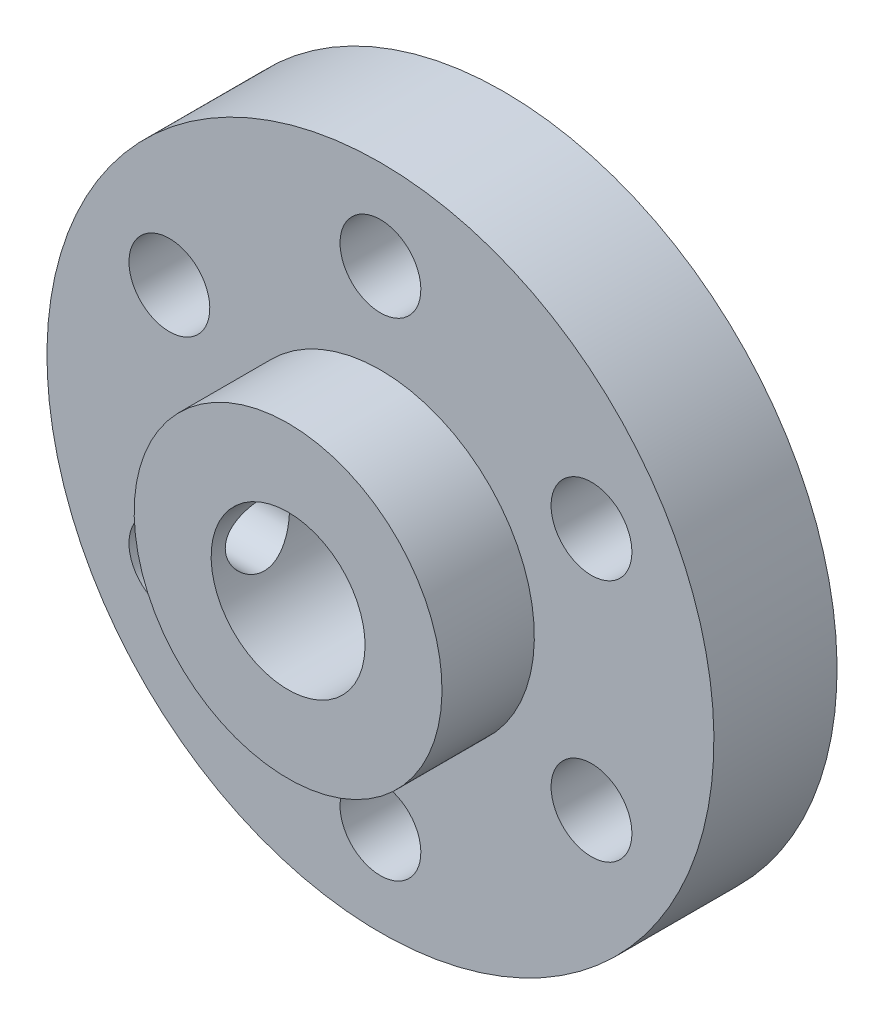
ISO-10303-21;
HEADER;
FILE_DESCRIPTION(('STEP AP214'),'2;1');
FILE_NAME('part.step','',(''),(''),'','','');
FILE_SCHEMA(('AUTOMOTIVE_DESIGN { 1 0 10303 214 1 1 1 1 }'));
ENDSEC;
DATA;
#1=APPLICATION_CONTEXT('core data for automotive mechanical design processes');
#2=APPLICATION_PROTOCOL_DEFINITION('international standard','automotive_design',2000,#1);
#3=PRODUCT_CONTEXT('',#1,'mechanical');
#4=PRODUCT('Part','Part','',(#3));
#5=PRODUCT_RELATED_PRODUCT_CATEGORY('part','',(#4));
#6=PRODUCT_DEFINITION_FORMATION('','',#4);
#7=PRODUCT_DEFINITION_CONTEXT('part definition',#1,'design');
#8=PRODUCT_DEFINITION('design','',#6,#7);
#9=PRODUCT_DEFINITION_SHAPE('','',#8);
#10=(LENGTH_UNIT() NAMED_UNIT(*) SI_UNIT(.MILLI.,.METRE.));
#11=(NAMED_UNIT(*) PLANE_ANGLE_UNIT() SI_UNIT($,.RADIAN.));
#12=(NAMED_UNIT(*) SI_UNIT($,.STERADIAN.) SOLID_ANGLE_UNIT());
#13=UNCERTAINTY_MEASURE_WITH_UNIT(LENGTH_MEASURE(1.E-05),#10,'distance_accuracy_value','');
#14=(GEOMETRIC_REPRESENTATION_CONTEXT(3) GLOBAL_UNCERTAINTY_ASSIGNED_CONTEXT((#13)) GLOBAL_UNIT_ASSIGNED_CONTEXT((#10,
#11,#12)) REPRESENTATION_CONTEXT('',''));
#15=CARTESIAN_POINT('',(0.,0.,0.));
#16=DIRECTION('',(0.,0.,1.));
#17=DIRECTION('',(1.,0.,0.));
#18=AXIS2_PLACEMENT_3D('',#15,#16,#17);
#19=CARTESIAN_POINT('',(0.,13.,0.));
#20=DIRECTION('',(0.,0.,-1.));
#21=DIRECTION('',(0.,1.,0.));
#22=AXIS2_PLACEMENT_3D('',#19,#20,#21);
#23=PLANE('',#22);
#24=CARTESIAN_POINT('',(0.,-9.5,0.));
#25=DIRECTION('',(0.,0.,-1.));
#26=DIRECTION('',(0.,1.,0.));
#27=AXIS2_PLACEMENT_3D('',#24,#25,#26);
#28=CIRCLE('',#27,1.575);
#29=CARTESIAN_POINT('',(0.,-7.925,0.));
#30=VERTEX_POINT('',#29);
#31=EDGE_CURVE('E86',#30,#30,#28,.T.);
#32=ORIENTED_EDGE('',*,*,#31,.F.);
#33=EDGE_LOOP('',(#32));
#34=FACE_BOUND('',#33,.T.);
#35=CARTESIAN_POINT('',(8.22724133595213,-4.75000000000006,0.));
#36=DIRECTION('',(0.,0.,-1.));
#37=DIRECTION('',(0.,1.,0.));
#38=AXIS2_PLACEMENT_3D('',#35,#36,#37);
#39=CIRCLE('',#38,1.575);
#40=CARTESIAN_POINT('',(8.22724133595213,-3.17500000000007,0.));
#41=VERTEX_POINT('',#40);
#42=EDGE_CURVE('E80',#41,#41,#39,.T.);
#43=ORIENTED_EDGE('',*,*,#42,.F.);
#44=EDGE_LOOP('',(#43));
#45=FACE_BOUND('',#44,.T.);
#46=CARTESIAN_POINT('',(8.2272413359522,4.74999999999996,0.));
#47=DIRECTION('',(0.,0.,-1.));
#48=DIRECTION('',(0.,1.,0.));
#49=AXIS2_PLACEMENT_3D('',#46,#47,#48);
#50=CIRCLE('',#49,1.575);
#51=CARTESIAN_POINT('',(8.2272413359522,6.32499999999995,0.));
#52=VERTEX_POINT('',#51);
#53=EDGE_CURVE('E74',#52,#52,#50,.T.);
#54=ORIENTED_EDGE('',*,*,#53,.F.);
#55=EDGE_LOOP('',(#54));
#56=FACE_BOUND('',#55,.T.);
#57=CARTESIAN_POINT('',(0.,9.5,0.));
#58=DIRECTION('',(0.,0.,-1.));
#59=DIRECTION('',(0.,1.,0.));
#60=AXIS2_PLACEMENT_3D('',#57,#58,#59);
#61=CIRCLE('',#60,1.575);
#62=CARTESIAN_POINT('',(0.,11.075,0.));
#63=VERTEX_POINT('',#62);
#64=EDGE_CURVE('E68',#63,#63,#61,.T.);
#65=ORIENTED_EDGE('',*,*,#64,.F.);
#66=EDGE_LOOP('',(#65));
#67=FACE_BOUND('',#66,.T.);
#68=CARTESIAN_POINT('',(-8.22724133595216,4.75000000000001,0.));
#69=DIRECTION('',(0.,0.,-1.));
#70=DIRECTION('',(0.,1.,0.));
#71=AXIS2_PLACEMENT_3D('',#68,#69,#70);
#72=CIRCLE('',#71,1.575);
#73=CARTESIAN_POINT('',(-8.22724133595216,6.325,0.));
#74=VERTEX_POINT('',#73);
#75=EDGE_CURVE('E62',#74,#74,#72,.T.);
#76=ORIENTED_EDGE('',*,*,#75,.F.);
#77=EDGE_LOOP('',(#76));
#78=FACE_BOUND('',#77,.T.);
#79=CARTESIAN_POINT('',(-8.22724133595216,-4.75000000000001,0.));
#80=DIRECTION('',(0.,0.,-1.));
#81=DIRECTION('',(0.,1.,0.));
#82=AXIS2_PLACEMENT_3D('',#79,#80,#81);
#83=CIRCLE('',#82,1.575);
#84=CARTESIAN_POINT('',(-8.22724133595216,-3.17500000000001,0.));
#85=VERTEX_POINT('',#84);
#86=EDGE_CURVE('E56',#85,#85,#83,.T.);
#87=ORIENTED_EDGE('',*,*,#86,.F.);
#88=EDGE_LOOP('',(#87));
#89=FACE_BOUND('',#88,.T.);
#90=CARTESIAN_POINT('',(0.,0.,0.));
#91=DIRECTION('',(0.,0.,-1.));
#92=DIRECTION('',(0.,1.,0.));
#93=AXIS2_PLACEMENT_3D('',#90,#91,#92);
#94=CIRCLE('',#93,13.);
#95=CARTESIAN_POINT('',(0.,13.,0.));
#96=VERTEX_POINT('',#95);
#97=EDGE_CURVE('E53',#96,#96,#94,.T.);
#98=ORIENTED_EDGE('',*,*,#97,.T.);
#99=EDGE_LOOP('',(#98));
#100=FACE_BOUND('',#99,.T.);
#101=CARTESIAN_POINT('',(0.,0.,0.));
#102=DIRECTION('',(0.,0.,-1.));
#103=DIRECTION('',(0.,1.,0.));
#104=AXIS2_PLACEMENT_3D('',#101,#102,#103);
#105=CIRCLE('',#104,3.);
#106=CARTESIAN_POINT('',(0.,3.,0.));
#107=VERTEX_POINT('',#106);
#108=EDGE_CURVE('E10',#107,#107,#105,.T.);
#109=ORIENTED_EDGE('',*,*,#108,.F.);
#110=EDGE_LOOP('',(#109));
#111=FACE_BOUND('',#110,.T.);
#112=ADVANCED_FACE('F31',(#34,#45,#56,#67,#78,#89,#100,#111),#23,.T.);
#113=CARTESIAN_POINT('',(0.,0.,6.17319530981986));
#114=DIRECTION('',(0.,0.,-1.));
#115=DIRECTION('',(0.,1.,0.));
#116=AXIS2_PLACEMENT_3D('',#113,#114,#115);
#117=CYLINDRICAL_SURFACE('',#116,3.);
#118=CARTESIAN_POINT('',(-3.,0.,5.35));
#119=CARTESIAN_POINT('',(-2.99999458367273,-0.0669580526362668,5.3500072050913));
#120=CARTESIAN_POINT('',(-2.9977323297471,-0.134021397063841,5.35541195852813));
#121=CARTESIAN_POINT('',(-2.98890153579552,-0.266247371156347,5.37683906492018));
#122=CARTESIAN_POINT('',(-2.98232175901028,-0.331404576423565,5.39288912446425));
#123=CARTESIAN_POINT('',(-2.96556289038127,-0.457688733653088,5.43491109178059));
#124=CARTESIAN_POINT('',(-2.95539599975004,-0.518828524426269,5.46084938946815));
#125=CARTESIAN_POINT('',(-2.93245286470664,-0.635829756679802,5.52177282323257));
#126=CARTESIAN_POINT('',(-2.91967741092849,-0.69169279001594,5.55675521897087));
#127=CARTESIAN_POINT('',(-2.89207828351869,-0.799448403559512,5.63662898259088));
#128=CARTESIAN_POINT('',(-2.87718753326093,-0.851041267517769,5.68190130878975));
#129=CARTESIAN_POINT('',(-2.84732714068514,-0.946159821091263,5.78026433478257));
#130=CARTESIAN_POINT('',(-2.83235746106809,-0.989681263153086,5.83335912489451));
#131=CARTESIAN_POINT('',(-2.80321021812995,-1.06953737697066,5.94902677756489));
#132=CARTESIAN_POINT('',(-2.78910786873385,-1.10541308153925,6.01193744842654));
#133=CARTESIAN_POINT('',(-2.76435572357005,-1.16593940588866,6.14357325792093));
#134=CARTESIAN_POINT('',(-2.75370415000823,-1.19059580836291,6.21229537948445));
#135=CARTESIAN_POINT('',(-2.73778555387705,-1.22674598312159,6.35015369176792));
#136=CARTESIAN_POINT('',(-2.73228387651787,-1.23881657877606,6.41911048339215));
#137=CARTESIAN_POINT('',(-2.72661326219504,-1.25125209967796,6.55827329268657));
#138=CARTESIAN_POINT('',(-2.7264413842526,-1.25162348054397,6.62847860002574));
#139=CARTESIAN_POINT('',(-2.73125119560853,-1.24108450363674,6.76240006043494));
#140=CARTESIAN_POINT('',(-2.73583882723623,-1.23103681112301,6.82620109656446));
#141=CARTESIAN_POINT('',(-2.74898482773796,-1.20139191015777,6.95111209100039));
#142=CARTESIAN_POINT('',(-2.75754395703564,-1.18179287287177,7.01222153149177));
#143=CARTESIAN_POINT('',(-2.77786184772756,-1.13321958727571,7.13155770299144));
#144=CARTESIAN_POINT('',(-2.78968481949136,-1.10405471539236,7.18969542091338));
#145=CARTESIAN_POINT('',(-2.81518331141086,-1.03731242580562,7.30047773388015));
#146=CARTESIAN_POINT('',(-2.82885956129779,-0.999731690519545,7.35312015061352));
#147=CARTESIAN_POINT('',(-2.85792976877979,-0.913495965543836,7.45609995873284));
#148=CARTESIAN_POINT('',(-2.87337121404473,-0.864173483207528,7.50586656738544));
#149=CARTESIAN_POINT('',(-2.90325673112529,-0.757729591051513,7.59661350295918));
#150=CARTESIAN_POINT('',(-2.9177005687701,-0.700606359448458,7.63759177169218));
#151=CARTESIAN_POINT('',(-2.94438283556473,-0.578447948693378,7.71043582361627));
#152=CARTESIAN_POINT('',(-2.95656266543334,-0.513260582447682,7.74206944515068));
#153=CARTESIAN_POINT('',(-2.97689481414803,-0.377852402526833,7.79372113960326));
#154=CARTESIAN_POINT('',(-2.985049358458,-0.307634394795037,7.81374563194382));
#155=CARTESIAN_POINT('',(-2.99599641186385,-0.168928113346229,7.84041599212664));
#156=CARTESIAN_POINT('',(-2.99909541047125,-0.10061128527864,7.84782785744375));
#157=CARTESIAN_POINT('',(-3.00056050368745,0.0363546554960884,7.85134622361409));
#158=CARTESIAN_POINT('',(-2.99892795711939,0.105003667152635,7.847455970252));
#159=CARTESIAN_POINT('',(-2.9913121765694,0.237098242341435,7.82902891519393));
#160=CARTESIAN_POINT('',(-2.9855488728399,0.300632966639386,7.8150300459028));
#161=CARTESIAN_POINT('',(-2.97048606772414,0.42438274897109,7.77753180545922));
#162=CARTESIAN_POINT('',(-2.96118611959704,0.484597386518361,7.7540312340497));
#163=CARTESIAN_POINT('',(-2.93958270645166,0.602108999869135,7.69742902428788));
#164=CARTESIAN_POINT('',(-2.92719491469281,0.659257236855322,7.66405181685397));
#165=CARTESIAN_POINT('',(-2.9007380457909,0.767346216231428,7.58894662220831));
#166=CARTESIAN_POINT('',(-2.88666826768733,0.818284352601941,7.54721514847073));
#167=CARTESIAN_POINT('',(-2.85712087895437,0.916333430274264,7.45309676672759));
#168=CARTESIAN_POINT('',(-2.84161451591029,0.962910697979835,7.40016149701374));
#169=CARTESIAN_POINT('',(-2.81184336768005,1.04666984610551,7.28697872406461));
#170=CARTESIAN_POINT('',(-2.79757886493438,1.08384959285617,7.22672956482827));
#171=CARTESIAN_POINT('',(-2.77181386243988,1.14815960208699,7.09938582469742));
#172=CARTESIAN_POINT('',(-2.76035562555111,1.17513918237329,7.03220596448517));
#173=CARTESIAN_POINT('',(-2.74208355658957,1.21717413951573,6.89362940618989));
#174=CARTESIAN_POINT('',(-2.73526589555752,1.23223934863688,6.82223623751665));
#175=CARTESIAN_POINT('',(-2.72763164537264,1.24904080348901,6.68318130080079));
#176=CARTESIAN_POINT('',(-2.72639350967162,1.25171380413129,6.61565533770739));
#177=CARTESIAN_POINT('',(-2.72893853011024,1.24615575523912,6.4811571388589));
#178=CARTESIAN_POINT('',(-2.73272091540306,1.23792637964722,6.41418481968631));
#179=CARTESIAN_POINT('',(-2.74449551302268,1.21158404780491,6.28590725253111));
#180=CARTESIAN_POINT('',(-2.7522835484648,1.19394903571466,6.22448332653661));
#181=CARTESIAN_POINT('',(-2.77103181199189,1.14976328202135,6.10545197864277));
#182=CARTESIAN_POINT('',(-2.78199293131693,1.12321003517252,6.04784563460122));
#183=CARTESIAN_POINT('',(-2.80666954560013,1.0601028593549,5.93430410405088));
#184=CARTESIAN_POINT('',(-2.82051102713679,1.02304360910483,5.87867766983171));
#185=CARTESIAN_POINT('',(-2.84903689053839,0.940684072630393,5.77413986063932));
#186=CARTESIAN_POINT('',(-2.86372156345875,0.89538092890562,5.72523082439943));
#187=CARTESIAN_POINT('',(-2.89356392850106,0.793902045778822,5.63185131831526));
#188=CARTESIAN_POINT('',(-2.90867817511791,0.737174739949029,5.58796356715935));
#189=CARTESIAN_POINT('',(-2.9366014362202,0.6166000792532,5.51030054645637));
#190=CARTESIAN_POINT('',(-2.9494093991674,0.552749497945747,5.47652988511044));
#191=CARTESIAN_POINT('',(-2.97109183362461,0.420732056717951,5.42079015456011));
#192=CARTESIAN_POINT('',(-2.98002782581964,0.352653990980636,5.3986352333827));
#193=CARTESIAN_POINT('',(-2.99321009768625,0.213410421846559,5.36629367092216));
#194=CARTESIAN_POINT('',(-2.99747105811967,0.142255316980958,5.35606955747012));
#195=CARTESIAN_POINT('',(-2.99972287568934,0.0472360819191838,5.35066683891355));
#196=CARTESIAN_POINT('',(-3.00000191102536,0.0236245946756573,5.34999745785078));
#197=CARTESIAN_POINT('',(-3.,0.,5.35));
#198=B_SPLINE_CURVE_WITH_KNOTS('',3,(#118,#119,#120,#121,#122,#123,#124,#125,#126,#127,#128,
#129,#130,#131,#132,#133,#134,#135,#136,#137,#138,#139,#140,#141,#142,#143,#144,#145,#146,#147,
#148,#149,#150,#151,#152,#153,#154,#155,#156,#157,#158,#159,#160,#161,#162,#163,#164,#165,#166,
#167,#168,#169,#170,#171,#172,#173,#174,#175,#176,#177,#178,#179,#180,#181,#182,#183,#184,#185,
#186,#187,#188,#189,#190,#191,#192,#193,#194,#195,#196,#197),.UNSPECIFIED.,.T.,.F.,(4,2,2,2,2,2,
2,2,2,2,2,2,2,2,2,2,2,2,2,2,2,2,2,2,2,2,2,2,2,2,2,2,2,2,2,2,2,2,2,4),(0.,0.200806918883939,
0.402138540628697,0.602791851906301,0.803384436852975,1.01317936288807,1.22308438131466,
1.44331724539125,1.66343646730588,1.87295273137558,2.08235338249046,2.27570157202557,
2.46908679727213,2.66658713058715,2.86416545717207,3.07844141127897,3.29276749314588,
3.51204055060813,3.73119224218297,3.93648443393251,4.14171767493172,4.33676589735722,
4.53183876601785,4.73297135272161,4.93418805469496,5.14978488029295,5.36543061240342,
5.58414788359524,5.80268447074581,6.00439877559644,6.20608211297537,6.39837649964763,
6.59072494950613,6.79463893397442,6.99862373425944,7.2174653500489,7.43640649428583,
7.65172855819386,7.86637250469322,7.93722256499099),.UNSPECIFIED.);
#199=CARTESIAN_POINT('',(-3.,0.,5.35));
#200=VERTEX_POINT('',#199);
#201=EDGE_CURVE('E122',#200,#200,#198,.T.);
#202=ORIENTED_EDGE('',*,*,#201,.T.);
#203=EDGE_LOOP('',(#202));
#204=FACE_BOUND('',#203,.T.);
#205=CARTESIAN_POINT('',(-3.,0.,1.15));
#206=CARTESIAN_POINT('',(-2.99999458367273,-0.0669580526362669,1.1500072050913));
#207=CARTESIAN_POINT('',(-2.9977323297471,-0.134021397063841,1.15541195852813));
#208=CARTESIAN_POINT('',(-2.98890153579552,-0.266247371156347,1.17683906492018));
#209=CARTESIAN_POINT('',(-2.98232175901028,-0.331404576423565,1.19288912446425));
#210=CARTESIAN_POINT('',(-2.96556289038127,-0.457688733653088,1.23491109178059));
#211=CARTESIAN_POINT('',(-2.95539599975004,-0.518828524426269,1.26084938946815));
#212=CARTESIAN_POINT('',(-2.93245286470664,-0.635829756679802,1.32177282323256));
#213=CARTESIAN_POINT('',(-2.91967741092849,-0.69169279001594,1.35675521897086));
#214=CARTESIAN_POINT('',(-2.89207828351869,-0.799448403559512,1.43662898259088));
#215=CARTESIAN_POINT('',(-2.87718753326093,-0.851041267517769,1.48190130878975));
#216=CARTESIAN_POINT('',(-2.84732714068514,-0.946159821091263,1.58026433478257));
#217=CARTESIAN_POINT('',(-2.83235746106809,-0.989681263153086,1.6333591248945));
#218=CARTESIAN_POINT('',(-2.80321021812995,-1.06953737697066,1.74902677756489));
#219=CARTESIAN_POINT('',(-2.78910786873385,-1.10541308153925,1.81193744842654));
#220=CARTESIAN_POINT('',(-2.76435572357005,-1.16593940588866,1.94357325792093));
#221=CARTESIAN_POINT('',(-2.75370415000823,-1.19059580836291,2.01229537948445));
#222=CARTESIAN_POINT('',(-2.73778555387705,-1.22674598312159,2.15015369176792));
#223=CARTESIAN_POINT('',(-2.73228387651787,-1.23881657877606,2.21911048339215));
#224=CARTESIAN_POINT('',(-2.72661326219504,-1.25125209967796,2.35827329268657));
#225=CARTESIAN_POINT('',(-2.7264413842526,-1.25162348054397,2.42847860002574));
#226=CARTESIAN_POINT('',(-2.73125119560853,-1.24108450363674,2.56240006043494));
#227=CARTESIAN_POINT('',(-2.73583882723623,-1.23103681112301,2.62620109656446));
#228=CARTESIAN_POINT('',(-2.74898482773796,-1.20139191015777,2.75111209100039));
#229=CARTESIAN_POINT('',(-2.75754395703564,-1.18179287287177,2.81222153149177));
#230=CARTESIAN_POINT('',(-2.77786184772756,-1.13321958727571,2.93155770299144));
#231=CARTESIAN_POINT('',(-2.78968481949136,-1.10405471539236,2.98969542091338));
#232=CARTESIAN_POINT('',(-2.81518331141086,-1.03731242580562,3.10047773388014));
#233=CARTESIAN_POINT('',(-2.82885956129779,-0.999731690519545,3.15312015061352));
#234=CARTESIAN_POINT('',(-2.85792976877979,-0.913495965543836,3.25609995873284));
#235=CARTESIAN_POINT('',(-2.87337121404473,-0.864173483207527,3.30586656738544));
#236=CARTESIAN_POINT('',(-2.90325673112529,-0.757729591051513,3.39661350295918));
#237=CARTESIAN_POINT('',(-2.9177005687701,-0.700606359448457,3.43759177169218));
#238=CARTESIAN_POINT('',(-2.94438283556473,-0.578447948693377,3.51043582361627));
#239=CARTESIAN_POINT('',(-2.95656266543334,-0.513260582447681,3.54206944515068));
#240=CARTESIAN_POINT('',(-2.97689481414803,-0.377852402526833,3.59372113960326));
#241=CARTESIAN_POINT('',(-2.985049358458,-0.307634394795036,3.61374563194382));
#242=CARTESIAN_POINT('',(-2.99599641186385,-0.168928113346229,3.64041599212664));
#243=CARTESIAN_POINT('',(-2.99909541047125,-0.100611285278639,3.64782785744375));
#244=CARTESIAN_POINT('',(-3.00056050368745,0.0363546554960889,3.65134622361409));
#245=CARTESIAN_POINT('',(-2.99892795711939,0.105003667152635,3.647455970252));
#246=CARTESIAN_POINT('',(-2.9913121765694,0.237098242341435,3.62902891519393));
#247=CARTESIAN_POINT('',(-2.9855488728399,0.300632966639386,3.6150300459028));
#248=CARTESIAN_POINT('',(-2.97048606772414,0.42438274897109,3.57753180545922));
#249=CARTESIAN_POINT('',(-2.96118611959704,0.484597386518361,3.5540312340497));
#250=CARTESIAN_POINT('',(-2.93958270645166,0.602108999869136,3.49742902428788));
#251=CARTESIAN_POINT('',(-2.92719491469281,0.659257236855324,3.46405181685397));
#252=CARTESIAN_POINT('',(-2.9007380457909,0.767346216231429,3.3889466222083));
#253=CARTESIAN_POINT('',(-2.88666826768733,0.818284352601942,3.34721514847073));
#254=CARTESIAN_POINT('',(-2.85712087895437,0.916333430274264,3.25309676672759));
#255=CARTESIAN_POINT('',(-2.84161451591029,0.962910697979836,3.20016149701374));
#256=CARTESIAN_POINT('',(-2.81184336768005,1.04666984610551,3.08697872406461));
#257=CARTESIAN_POINT('',(-2.79757886493438,1.08384959285617,3.02672956482827));
#258=CARTESIAN_POINT('',(-2.77181386243988,1.14815960208699,2.89938582469742));
#259=CARTESIAN_POINT('',(-2.76035562555111,1.17513918237329,2.83220596448517));
#260=CARTESIAN_POINT('',(-2.74208355658957,1.21717413951573,2.69362940618989));
#261=CARTESIAN_POINT('',(-2.73526589555752,1.23223934863688,2.62223623751665));
#262=CARTESIAN_POINT('',(-2.72763164537264,1.24904080348901,2.48318130080079));
#263=CARTESIAN_POINT('',(-2.72639350967163,1.25171380413129,2.41565533770738));
#264=CARTESIAN_POINT('',(-2.72893853011024,1.24615575523912,2.2811571388589));
#265=CARTESIAN_POINT('',(-2.73272091540306,1.23792637964722,2.2141848196863));
#266=CARTESIAN_POINT('',(-2.74449551302268,1.21158404780491,2.08590725253111));
#267=CARTESIAN_POINT('',(-2.7522835484648,1.19394903571466,2.02448332653661));
#268=CARTESIAN_POINT('',(-2.77103181199189,1.14976328202135,1.90545197864277));
#269=CARTESIAN_POINT('',(-2.78199293131693,1.12321003517252,1.84784563460122));
#270=CARTESIAN_POINT('',(-2.80666954560013,1.0601028593549,1.73430410405088));
#271=CARTESIAN_POINT('',(-2.82051102713679,1.02304360910483,1.67867766983171));
#272=CARTESIAN_POINT('',(-2.84903689053839,0.940684072630392,1.57413986063932));
#273=CARTESIAN_POINT('',(-2.86372156345875,0.89538092890562,1.52523082439943));
#274=CARTESIAN_POINT('',(-2.89356392850106,0.793902045778821,1.43185131831525));
#275=CARTESIAN_POINT('',(-2.90867817511792,0.737174739949028,1.38796356715935));
#276=CARTESIAN_POINT('',(-2.9366014362202,0.616600079253199,1.31030054645637));
#277=CARTESIAN_POINT('',(-2.9494093991674,0.552749497945746,1.27652988511044));
#278=CARTESIAN_POINT('',(-2.97109183362461,0.42073205671795,1.22079015456011));
#279=CARTESIAN_POINT('',(-2.98002782581964,0.352653990980636,1.1986352333827));
#280=CARTESIAN_POINT('',(-2.99321009768625,0.213410421846558,1.16629367092216));
#281=CARTESIAN_POINT('',(-2.99747105811967,0.142255316980957,1.15606955747011));
#282=CARTESIAN_POINT('',(-2.99972287568934,0.0472360819191832,1.15066683891355));
#283=CARTESIAN_POINT('',(-3.00000191102536,0.023624594675657,1.14999745785078));
#284=CARTESIAN_POINT('',(-3.,0.,1.15));
#285=B_SPLINE_CURVE_WITH_KNOTS('',3,(#205,#206,#207,#208,#209,#210,#211,#212,#213,#214,#215,
#216,#217,#218,#219,#220,#221,#222,#223,#224,#225,#226,#227,#228,#229,#230,#231,#232,#233,#234,
#235,#236,#237,#238,#239,#240,#241,#242,#243,#244,#245,#246,#247,#248,#249,#250,#251,#252,#253,
#254,#255,#256,#257,#258,#259,#260,#261,#262,#263,#264,#265,#266,#267,#268,#269,#270,#271,#272,
#273,#274,#275,#276,#277,#278,#279,#280,#281,#282,#283,#284),.UNSPECIFIED.,.T.,.F.,(4,2,2,2,2,2,
2,2,2,2,2,2,2,2,2,2,2,2,2,2,2,2,2,2,2,2,2,2,2,2,2,2,2,2,2,2,2,2,2,4),(0.,0.200806918883939,
0.402138540628697,0.602791851906301,0.803384436852975,1.01317936288807,1.22308438131465,
1.44331724539125,1.66343646730588,1.87295273137558,2.08235338249046,2.27570157202557,
2.46908679727213,2.66658713058715,2.86416545717207,3.07844141127897,3.29276749314588,
3.51204055060813,3.73119224218297,3.93648443393251,4.14171767493172,4.33676589735722,
4.53183876601785,4.73297135272161,4.93418805469496,5.14978488029295,5.36543061240342,
5.58414788359524,5.80268447074581,6.00439877559644,6.20608211297537,6.39837649964763,
6.59072494950613,6.79463893397442,6.99862373425945,7.2174653500489,7.43640649428583,
7.65172855819386,7.86637250469322,7.93722256499099),.UNSPECIFIED.);
#286=CARTESIAN_POINT('',(-3.,0.,1.15));
#287=VERTEX_POINT('',#286);
#288=EDGE_CURVE('E92',#287,#287,#285,.T.);
#289=ORIENTED_EDGE('',*,*,#288,.T.);
#290=EDGE_LOOP('',(#289));
#291=FACE_BOUND('',#290,.T.);
#292=ORIENTED_EDGE('',*,*,#108,.T.);
#293=EDGE_LOOP('',(#292));
#294=FACE_BOUND('',#293,.T.);
#295=CARTESIAN_POINT('',(0.,0.,8.4));
#296=DIRECTION('',(0.,0.,-1.));
#297=DIRECTION('',(0.,1.,0.));
#298=AXIS2_PLACEMENT_3D('',#295,#296,#297);
#299=CIRCLE('',#298,3.);
#300=CARTESIAN_POINT('',(0.,3.,8.4));
#301=VERTEX_POINT('',#300);
#302=EDGE_CURVE('E37',#301,#301,#299,.T.);
#303=ORIENTED_EDGE('',*,*,#302,.F.);
#304=EDGE_LOOP('',(#303));
#305=FACE_BOUND('',#304,.T.);
#306=ADVANCED_FACE('F159',(#204,#291,#294,#305),#117,.F.);
#307=CARTESIAN_POINT('',(0.,3.,8.4));
#308=DIRECTION('',(0.,0.,1.));
#309=DIRECTION('',(0.,-1.,0.));
#310=AXIS2_PLACEMENT_3D('',#307,#308,#309);
#311=PLANE('',#310);
#312=ORIENTED_EDGE('',*,*,#302,.T.);
#313=EDGE_LOOP('',(#312));
#314=FACE_BOUND('',#313,.T.);
#315=CARTESIAN_POINT('',(0.,0.,8.4));
#316=DIRECTION('',(0.,0.,-1.));
#317=DIRECTION('',(0.,1.,0.));
#318=AXIS2_PLACEMENT_3D('',#315,#316,#317);
#319=CIRCLE('',#318,6.);
#320=CARTESIAN_POINT('',(0.,6.,8.4));
#321=VERTEX_POINT('',#320);
#322=EDGE_CURVE('E41',#321,#321,#319,.T.);
#323=ORIENTED_EDGE('',*,*,#322,.F.);
#324=EDGE_LOOP('',(#323));
#325=FACE_BOUND('',#324,.T.);
#326=ADVANCED_FACE('F137',(#314,#325),#311,.T.);
#327=CARTESIAN_POINT('',(0.,0.,6.17319530981986));
#328=DIRECTION('',(0.,0.,-1.));
#329=DIRECTION('',(0.,1.,0.));
#330=AXIS2_PLACEMENT_3D('',#327,#328,#329);
#331=CYLINDRICAL_SURFACE('',#330,6.);
#332=CARTESIAN_POINT('',(-6.,0.,5.35));
#333=CARTESIAN_POINT('',(-5.99999871526651,0.0694090417016607,5.35000247746922));
#334=CARTESIAN_POINT('',(-5.99878328775043,0.138848789520876,5.35580066571875));
#335=CARTESIAN_POINT('',(-5.99405200990679,0.275761316266993,5.37881934953285));
#336=CARTESIAN_POINT('',(-5.99053441189248,0.343232560128313,5.39604852303693));
#337=CARTESIAN_POINT('',(-5.98159109196201,0.474209132291342,5.44137045492182));
#338=CARTESIAN_POINT('',(-5.97616727052645,0.537718336709185,5.46945239599889));
#339=CARTESIAN_POINT('',(-5.96399927809858,0.659120328605958,5.53564960885618));
#340=CARTESIAN_POINT('',(-5.95725516625975,0.717013367534327,5.57376443115583));
#341=CARTESIAN_POINT('',(-5.9430770002465,0.826390324308837,5.65953634019064));
#342=CARTESIAN_POINT('',(-5.93563505848531,0.877780244162685,5.70731200123508));
#343=CARTESIAN_POINT('',(-5.92095657692448,0.971877776769393,5.81079465919511));
#344=CARTESIAN_POINT('',(-5.91372005416683,1.01458467096099,5.86650231187226));
#345=CARTESIAN_POINT('',(-5.90019442595308,1.09051031677217,5.98495196876616));
#346=CARTESIAN_POINT('',(-5.89391545174828,1.12363054680651,6.04775838450274));
#347=CARTESIAN_POINT('',(-5.8831284065002,1.17881119348064,6.17819745177276));
#348=CARTESIAN_POINT('',(-5.87862014467568,1.20087280167641,6.24582958244254));
#349=CARTESIAN_POINT('',(-5.87196500986122,1.23300240133737,6.38298523741564));
#350=CARTESIAN_POINT('',(-5.86978556855865,1.24323597696799,6.45246835933477));
#351=CARTESIAN_POINT('',(-5.8679369071649,1.25193357655615,6.59219684286263));
#352=CARTESIAN_POINT('',(-5.86826740800981,1.25039890894687,6.6624421188653));
#353=CARTESIAN_POINT('',(-5.87137174319175,1.23573719037197,6.80048102797518));
#354=CARTESIAN_POINT('',(-5.874105336799,1.2228010523272,6.86829597966121));
#355=CARTESIAN_POINT('',(-5.88164437615942,1.18600543529945,7.00077150964493));
#356=CARTESIAN_POINT('',(-5.88644992841317,1.16214539481382,7.06543192560633));
#357=CARTESIAN_POINT('',(-5.89763191464102,1.10400003213928,7.19030722841598));
#358=CARTESIAN_POINT('',(-5.90401953785585,1.06964002534237,7.25048629652707));
#359=CARTESIAN_POINT('',(-5.91763890010721,0.991522699274817,7.36429574426816));
#360=CARTESIAN_POINT('',(-5.92487074398537,0.947764212262587,7.41792530883598));
#361=CARTESIAN_POINT('',(-5.93953730929908,0.851074921546783,7.51821396108037));
#362=CARTESIAN_POINT('',(-5.94697323199473,0.797981433412082,7.56471616889701));
#363=CARTESIAN_POINT('',(-5.96108088143001,0.684667288611798,7.64818044222897));
#364=CARTESIAN_POINT('',(-5.96775259670236,0.624446525025766,7.6851423645984));
#365=CARTESIAN_POINT('',(-5.97959870942815,0.498405541235479,7.74851008153595));
#366=CARTESIAN_POINT('',(-5.98477039710258,0.4325754619265,7.77489680456712));
#367=CARTESIAN_POINT('',(-5.99301338211281,0.297284620972156,7.81619170483549));
#368=CARTESIAN_POINT('',(-5.99608495596053,0.22782433859509,7.8311013932314));
#369=CARTESIAN_POINT('',(-5.99974275215455,0.0885918657008356,7.84879425206789));
#370=CARTESIAN_POINT('',(-6.00037293537579,0.0188480555261793,7.85179194149425));
#371=CARTESIAN_POINT('',(-5.99919952252774,-0.120143798757714,7.8461550500309));
#372=CARTESIAN_POINT('',(-5.99739607548153,-0.189391872962258,7.8375211813984));
#373=CARTESIAN_POINT('',(-5.99158564979184,-0.324726367119814,7.80904434653047));
#374=CARTESIAN_POINT('',(-5.98760052868077,-0.390837192894207,7.78931251461653));
#375=CARTESIAN_POINT('',(-5.97787227242394,-0.518811446661332,7.73932213957859));
#376=CARTESIAN_POINT('',(-5.97212899744578,-0.580674536336776,7.70906275913402));
#377=CARTESIAN_POINT('',(-5.95941241490714,-0.699294306943495,7.63841962176244));
#378=CARTESIAN_POINT('',(-5.9524239381233,-0.755973219469835,7.59790807043094));
#379=CARTESIAN_POINT('',(-5.93802568299709,-0.861805445886521,7.50808043692373));
#380=CARTESIAN_POINT('',(-5.93061585542511,-0.910957877913287,7.45876332448106));
#381=CARTESIAN_POINT('',(-5.91606024531376,-1.0011786486518,7.3517444230003));
#382=CARTESIAN_POINT('',(-5.90892089307501,-1.04209914600204,7.29391696804472));
#383=CARTESIAN_POINT('',(-5.89585601015805,-1.11364719079244,7.17208371578621));
#384=CARTESIAN_POINT('',(-5.88993042894651,-1.14427516677864,7.10807817586089));
#385=CARTESIAN_POINT('',(-5.88001700708041,-1.19417246443922,6.97603880370177));
#386=CARTESIAN_POINT('',(-5.87601872784687,-1.21350309828032,6.90802896283416));
#387=CARTESIAN_POINT('',(-5.87039184709697,-1.24044038523407,6.76963344950774));
#388=CARTESIAN_POINT('',(-5.86876290660367,-1.24804871544441,6.69924811838056));
#389=CARTESIAN_POINT('',(-5.86807907308506,-1.25125926487611,6.55958659900035));
#390=CARTESIAN_POINT('',(-5.86897402321502,-1.24709542622725,6.49031592977795));
#391=CARTESIAN_POINT('',(-5.87312447254927,-1.22739905314032,6.35348599107978));
#392=CARTESIAN_POINT('',(-5.87637994909626,-1.21186662782266,6.28592670518389));
#393=CARTESIAN_POINT('',(-5.88486132447716,-1.16998217768585,6.15460222810934));
#394=CARTESIAN_POINT('',(-5.8900815700793,-1.14366117568421,6.09082675351307));
#395=CARTESIAN_POINT('',(-5.90190705738738,-1.08097457299757,5.96856122397333));
#396=CARTESIAN_POINT('',(-5.9085124276546,-1.0446080398303,5.91007166036688));
#397=CARTESIAN_POINT('',(-5.92251579551146,-0.962073695342411,5.79887837292055));
#398=CARTESIAN_POINT('',(-5.92992613868404,-0.915737890418226,5.74630087543502));
#399=CARTESIAN_POINT('',(-5.94461839583212,-0.814924438115334,5.64959050677364));
#400=CARTESIAN_POINT('',(-5.95190027984879,-0.760444918832968,5.60545958244851));
#401=CARTESIAN_POINT('',(-5.96561444547637,-0.644134427507703,5.52641142681594));
#402=CARTESIAN_POINT('',(-5.97203596073244,-0.582225921521348,5.49160632011371));
#403=CARTESIAN_POINT('',(-5.98319908494092,-0.453319843998453,5.43294977156998));
#404=CARTESIAN_POINT('',(-5.98794216182101,-0.386326781907243,5.40908875281812));
#405=CARTESIAN_POINT('',(-5.99432499781443,-0.266015292900105,5.37745972171157));
#406=CARTESIAN_POINT('',(-5.99644035661395,-0.213367593727929,5.36718123679114));
#407=CARTESIAN_POINT('',(-5.99927832789758,-0.107152674176537,5.35345054572267));
#408=CARTESIAN_POINT('',(-6.00000099184586,-0.0535854878488717,5.34999808733281));
#409=CARTESIAN_POINT('',(-6.,0.,5.35));
#410=B_SPLINE_CURVE_WITH_KNOTS('',3,(#332,#333,#334,#335,#336,#337,#338,#339,#340,#341,#342,
#343,#344,#345,#346,#347,#348,#349,#350,#351,#352,#353,#354,#355,#356,#357,#358,#359,#360,#361,
#362,#363,#364,#365,#366,#367,#368,#369,#370,#371,#372,#373,#374,#375,#376,#377,#378,#379,#380,
#381,#382,#383,#384,#385,#386,#387,#388,#389,#390,#391,#392,#393,#394,#395,#396,#397,#398,#399,
#400,#401,#402,#403,#404,#405,#406,#407,#408,#409),.UNSPECIFIED.,.T.,.F.,(4,2,2,2,2,2,2,2,2,2,2,
2,2,2,2,2,2,2,2,2,2,2,2,2,2,2,2,2,2,2,2,2,2,2,2,2,2,2,4),(0.,0.208031045103183,
0.416220199906225,0.624202378825442,0.83217524157299,1.04287526388123,1.25359271551786,
1.46640449178549,1.6791933328549,1.88896575169854,2.09871484767165,2.3050171212906,
2.5113300003028,2.71914592416749,2.92698768368035,3.13889526355466,3.35080602278218,
3.56309724499663,3.77536051045772,3.98378339407676,4.19219351552278,4.39855286632622,
4.60492863390933,4.81401583995737,5.02312752564574,5.23571263829337,5.44828889851309,
5.65970050095025,5.87108185414185,6.07829223291039,6.28550062281361,6.49211731393255,
6.6987531908148,6.90919024830309,7.1196757511737,7.33258864398257,7.54531486464974,
7.7059258847728,7.86653096973392),.UNSPECIFIED.);
#411=CARTESIAN_POINT('',(-6.,0.,5.35));
#412=VERTEX_POINT('',#411);
#413=EDGE_CURVE('E119',#412,#412,#410,.T.);
#414=ORIENTED_EDGE('',*,*,#413,.T.);
#415=EDGE_LOOP('',(#414));
#416=FACE_BOUND('',#415,.T.);
#417=ORIENTED_EDGE('',*,*,#322,.T.);
#418=EDGE_LOOP('',(#417));
#419=FACE_BOUND('',#418,.T.);
#420=CARTESIAN_POINT('',(0.,0.,4.8));
#421=DIRECTION('',(0.,0.,-1.));
#422=DIRECTION('',(0.,1.,0.));
#423=AXIS2_PLACEMENT_3D('',#420,#421,#422);
#424=CIRCLE('',#423,6.);
#425=CARTESIAN_POINT('',(0.,6.,4.8));
#426=VERTEX_POINT('',#425);
#427=EDGE_CURVE('E45',#426,#426,#424,.T.);
#428=ORIENTED_EDGE('',*,*,#427,.F.);
#429=EDGE_LOOP('',(#428));
#430=FACE_BOUND('',#429,.T.);
#431=ADVANCED_FACE('F132',(#416,#419,#430),#331,.T.);
#432=CARTESIAN_POINT('',(0.,6.,4.8));
#433=DIRECTION('',(0.,0.,1.));
#434=DIRECTION('',(0.,-1.,0.));
#435=AXIS2_PLACEMENT_3D('',#432,#433,#434);
#436=PLANE('',#435);
#437=CARTESIAN_POINT('',(0.,-9.5,4.8));
#438=DIRECTION('',(0.,0.,1.));
#439=DIRECTION('',(0.,-1.,0.));
#440=AXIS2_PLACEMENT_3D('',#437,#438,#439);
#441=CIRCLE('',#440,1.575);
#442=CARTESIAN_POINT('',(0.,-11.075,4.8));
#443=VERTEX_POINT('',#442);
#444=EDGE_CURVE('E89',#443,#443,#441,.T.);
#445=ORIENTED_EDGE('',*,*,#444,.F.);
#446=EDGE_LOOP('',(#445));
#447=FACE_BOUND('',#446,.T.);
#448=CARTESIAN_POINT('',(8.22724133595213,-4.75000000000007,4.8));
#449=DIRECTION('',(0.,0.,1.));
#450=DIRECTION('',(0.,-1.,0.));
#451=AXIS2_PLACEMENT_3D('',#448,#449,#450);
#452=CIRCLE('',#451,1.575);
#453=CARTESIAN_POINT('',(8.22724133595213,-6.32500000000006,4.8));
#454=VERTEX_POINT('',#453);
#455=EDGE_CURVE('E83',#454,#454,#452,.T.);
#456=ORIENTED_EDGE('',*,*,#455,.F.);
#457=EDGE_LOOP('',(#456));
#458=FACE_BOUND('',#457,.T.);
#459=CARTESIAN_POINT('',(8.2272413359522,4.74999999999995,4.8));
#460=DIRECTION('',(0.,0.,1.));
#461=DIRECTION('',(0.,-1.,0.));
#462=AXIS2_PLACEMENT_3D('',#459,#460,#461);
#463=CIRCLE('',#462,1.575);
#464=CARTESIAN_POINT('',(8.2272413359522,3.17499999999996,4.8));
#465=VERTEX_POINT('',#464);
#466=EDGE_CURVE('E77',#465,#465,#463,.T.);
#467=ORIENTED_EDGE('',*,*,#466,.F.);
#468=EDGE_LOOP('',(#467));
#469=FACE_BOUND('',#468,.T.);
#470=CARTESIAN_POINT('',(0.,9.5,4.8));
#471=DIRECTION('',(0.,0.,1.));
#472=DIRECTION('',(0.,-1.,0.));
#473=AXIS2_PLACEMENT_3D('',#470,#471,#472);
#474=CIRCLE('',#473,1.575);
#475=CARTESIAN_POINT('',(0.,7.925,4.8));
#476=VERTEX_POINT('',#475);
#477=EDGE_CURVE('E71',#476,#476,#474,.T.);
#478=ORIENTED_EDGE('',*,*,#477,.F.);
#479=EDGE_LOOP('',(#478));
#480=FACE_BOUND('',#479,.T.);
#481=CARTESIAN_POINT('',(-8.22724133595216,4.75000000000001,4.8));
#482=DIRECTION('',(0.,0.,1.));
#483=DIRECTION('',(0.,-1.,0.));
#484=AXIS2_PLACEMENT_3D('',#481,#482,#483);
#485=CIRCLE('',#484,1.575);
#486=CARTESIAN_POINT('',(-8.22724133595216,3.17500000000001,4.8));
#487=VERTEX_POINT('',#486);
#488=EDGE_CURVE('E65',#487,#487,#485,.T.);
#489=ORIENTED_EDGE('',*,*,#488,.F.);
#490=EDGE_LOOP('',(#489));
#491=FACE_BOUND('',#490,.T.);
#492=CARTESIAN_POINT('',(-8.22724133595216,-4.75000000000001,4.8));
#493=DIRECTION('',(0.,0.,1.));
#494=DIRECTION('',(0.,-1.,0.));
#495=AXIS2_PLACEMENT_3D('',#492,#493,#494);
#496=CIRCLE('',#495,1.575);
#497=CARTESIAN_POINT('',(-8.22724133595216,-6.32500000000001,4.8));
#498=VERTEX_POINT('',#497);
#499=EDGE_CURVE('E59',#498,#498,#496,.T.);
#500=ORIENTED_EDGE('',*,*,#499,.F.);
#501=EDGE_LOOP('',(#500));
#502=FACE_BOUND('',#501,.T.);
#503=ORIENTED_EDGE('',*,*,#427,.T.);
#504=EDGE_LOOP('',(#503));
#505=FACE_BOUND('',#504,.T.);
#506=CARTESIAN_POINT('',(0.,0.,4.8));
#507=DIRECTION('',(0.,0.,-1.));
#508=DIRECTION('',(0.,1.,0.));
#509=AXIS2_PLACEMENT_3D('',#506,#507,#508);
#510=CIRCLE('',#509,13.);
#511=CARTESIAN_POINT('',(0.,13.,4.8));
#512=VERTEX_POINT('',#511);
#513=EDGE_CURVE('E50',#512,#512,#510,.T.);
#514=ORIENTED_EDGE('',*,*,#513,.F.);
#515=EDGE_LOOP('',(#514));
#516=FACE_BOUND('',#515,.T.);
#517=ADVANCED_FACE('F136',(#447,#458,#469,#480,#491,#502,#505,#516),#436,.T.);
#518=CARTESIAN_POINT('',(0.,0.,6.17319530981986));
#519=DIRECTION('',(0.,0.,-1.));
#520=DIRECTION('',(0.,1.,0.));
#521=AXIS2_PLACEMENT_3D('',#518,#519,#520);
#522=CYLINDRICAL_SURFACE('',#521,13.);
#523=CARTESIAN_POINT('',(-13.,0.,1.15));
#524=CARTESIAN_POINT('',(-12.9999992218953,0.0700395454273369,1.15000303977236));
#525=CARTESIAN_POINT('',(-12.9994279570574,0.140125736712685,1.15590646022567));
#526=CARTESIAN_POINT('',(-12.9972039987612,0.278356023972752,1.179367787616));
#527=CARTESIAN_POINT('',(-12.9955501055673,0.346497877764225,1.19693862433798));
#528=CARTESIAN_POINT('',(-12.9913476355749,0.478817693387374,1.24321938687686));
#529=CARTESIAN_POINT('',(-12.9887995908131,0.542997985775765,1.27192268973786));
#530=CARTESIAN_POINT('',(-12.9830939390627,0.665615463885838,1.33964098971105));
#531=CARTESIAN_POINT('',(-12.9799364555798,0.724053809626487,1.37865389812102));
#532=CARTESIAN_POINT('',(-12.9733539822169,0.833738059973964,1.46602399735709));
#533=CARTESIAN_POINT('',(-12.9699282262667,0.884962104887811,1.51440857561963));
#534=CARTESIAN_POINT('',(-12.9632016692502,0.978575881862819,1.61909024767539));
#535=CARTESIAN_POINT('',(-12.9599008738958,1.02096521049874,1.67538770260285));
#536=CARTESIAN_POINT('',(-12.9537900496162,1.09578294342739,1.79443288438234));
#537=CARTESIAN_POINT('',(-12.9509809937028,1.12819169304498,1.85719301806845));
#538=CARTESIAN_POINT('',(-12.9461810408994,1.18200279216686,1.98729589329388));
#539=CARTESIAN_POINT('',(-12.9441901252254,1.20340539436805,2.05463852958052));
#540=CARTESIAN_POINT('',(-12.9412586919906,1.23453215970632,2.19177269661265));
#541=CARTESIAN_POINT('',(-12.9403149264888,1.24429244088808,2.26155595868305));
#542=CARTESIAN_POINT('',(-12.9395745274106,1.25196913662804,2.40177606179202));
#543=CARTESIAN_POINT('',(-12.9397778658154,1.24988584047395,2.47221288682491));
#544=CARTESIAN_POINT('',(-12.9413057369858,1.23396430730974,2.61149206049021));
#545=CARTESIAN_POINT('',(-12.9426265125999,1.22016546086922,2.68033895900979));
#546=CARTESIAN_POINT('',(-12.9462345658184,1.18126579353027,2.81473508769166));
#547=CARTESIAN_POINT('',(-12.9485218555909,1.15616483034252,2.8802842763255));
#548=CARTESIAN_POINT('',(-12.9538095418947,1.09532982030078,3.00634898833467));
#549=CARTESIAN_POINT('',(-12.9568111120658,1.05957824873781,3.06685600358937));
#550=CARTESIAN_POINT('',(-12.9631881444639,0.978469480219147,3.18102570929626));
#551=CARTESIAN_POINT('',(-12.9665636168023,0.933112023463791,3.23468821456971));
#552=CARTESIAN_POINT('',(-12.9733248595388,0.833858782138977,3.33387454996785));
#553=CARTESIAN_POINT('',(-12.9767106158774,0.779928970285432,3.37936433776333));
#554=CARTESIAN_POINT('',(-12.9830979262229,0.665180181203469,3.46065025539115));
#555=CARTESIAN_POINT('',(-12.9860994798466,0.604361197107262,3.49644637555977));
#556=CARTESIAN_POINT('',(-12.9913810699768,0.477537264932486,3.55732728607951));
#557=CARTESIAN_POINT('',(-12.9936609937716,0.411531508737654,3.58241040337604));
#558=CARTESIAN_POINT('',(-12.9972412572444,0.276218575923909,3.62112861670777));
#559=CARTESIAN_POINT('',(-12.9985416240008,0.206911490621653,3.63476402919897));
#560=CARTESIAN_POINT('',(-13.0000127799493,0.0672581464717232,3.65015671150602));
#561=CARTESIAN_POINT('',(-13.0001880374211,-0.00308288833388798,3.65196096840397));
#562=CARTESIAN_POINT('',(-12.9994011977085,-0.143066366037193,3.6437634545741));
#563=CARTESIAN_POINT('',(-12.9984391147117,-0.212708817638289,3.63376183111628));
#564=CARTESIAN_POINT('',(-12.9954885909243,-0.349183022505995,3.60227543810034));
#565=CARTESIAN_POINT('',(-12.9935021118921,-0.416019884968308,3.58081261440674));
#566=CARTESIAN_POINT('',(-12.9887257244406,-0.545144337270877,3.52703559071818));
#567=CARTESIAN_POINT('',(-12.9859357993015,-0.607431832404089,3.49472116489695));
#568=CARTESIAN_POINT('',(-12.9798536237485,-0.725902223119139,3.42004131436439));
#569=CARTESIAN_POINT('',(-12.9765598386527,-0.782065538511857,3.3776449550751));
#570=CARTESIAN_POINT('',(-12.9698446318738,-0.886495235001599,3.28404915113625));
#571=CARTESIAN_POINT('',(-12.9664232072337,-0.934761433012657,3.23284950244855));
#572=CARTESIAN_POINT('',(-12.9598249456202,-1.0221894543887,3.12289574571696));
#573=CARTESIAN_POINT('',(-12.9566489594136,-1.06132048313187,3.06411709358735));
#574=CARTESIAN_POINT('',(-12.9509139050058,-1.129155819334,2.94079517223963));
#575=CARTESIAN_POINT('',(-12.9483548289218,-1.15786026002456,2.87625197669435));
#576=CARTESIAN_POINT('',(-12.9441485315908,-1.20397582971432,2.74333956725301));
#577=CARTESIAN_POINT('',(-12.9424998210535,-1.22140541160731,2.67497680489114));
#578=CARTESIAN_POINT('',(-12.9402962191554,-1.24453642670967,2.53627840790644));
#579=CARTESIAN_POINT('',(-12.9397412989981,-1.25023816868133,2.46594282527205));
#580=CARTESIAN_POINT('',(-12.9397886701037,-1.24974754744341,2.32560141891772));
#581=CARTESIAN_POINT('',(-12.9403862546954,-1.24360356059377,2.25559541944917));
#582=CARTESIAN_POINT('',(-12.9426612757535,-1.21969718108888,2.11761487117848));
#583=CARTESIAN_POINT('',(-12.9443387135522,-1.20193477409703,2.04964032488316));
#584=CARTESIAN_POINT('',(-12.9485831473165,-1.15530885095639,1.91765174783187));
#585=CARTESIAN_POINT('',(-12.9511500399983,-1.12644662367959,1.85363725824952));
#586=CARTESIAN_POINT('',(-12.9568843652751,-1.05844542466451,1.73135379648256));
#587=CARTESIAN_POINT('',(-12.9600517930197,-1.01930653592749,1.67308477789886));
#588=CARTESIAN_POINT('',(-12.9666457740777,-0.93168122707152,1.5636984025489));
#589=CARTESIAN_POINT('',(-12.9700732937474,-0.883158794758856,1.51260995152485));
#590=CARTESIAN_POINT('',(-12.9767924245843,-0.778213948519765,1.41927854006855));
#591=CARTESIAN_POINT('',(-12.9800840029209,-0.721789640521863,1.37703770647734));
#592=CARTESIAN_POINT('',(-12.9861683153416,-0.602499056073222,1.30252378126465));
#593=CARTESIAN_POINT('',(-12.9889598572575,-0.539617932106111,1.2702743808437));
#594=CARTESIAN_POINT('',(-12.9937163984295,-0.409347100447144,1.21683448782582));
#595=CARTESIAN_POINT('',(-12.9956823336186,-0.341962598959868,1.19563146612027));
#596=CARTESIAN_POINT('',(-12.9980695257425,-0.228493822820207,1.17020118585367));
#597=CARTESIAN_POINT('',(-12.9987900976756,-0.183136023066319,1.16263602179595));
#598=CARTESIAN_POINT('',(-12.9997555890965,-0.0918588367138317,1.15253444137568));
#599=CARTESIAN_POINT('',(-13.0000005103646,-0.0459394522178491,1.14999800619098));
#600=CARTESIAN_POINT('',(-13.,0.,1.15));
#601=B_SPLINE_CURVE_WITH_KNOTS('',3,(#523,#524,#525,#526,#527,#528,#529,#530,#531,#532,#533,
#534,#535,#536,#537,#538,#539,#540,#541,#542,#543,#544,#545,#546,#547,#548,#549,#550,#551,#552,
#553,#554,#555,#556,#557,#558,#559,#560,#561,#562,#563,#564,#565,#566,#567,#568,#569,#570,#571,
#572,#573,#574,#575,#576,#577,#578,#579,#580,#581,#582,#583,#584,#585,#586,#587,#588,#589,#590,
#591,#592,#593,#594,#595,#596,#597,#598,#599,#600),.UNSPECIFIED.,.T.,.F.,(4,2,2,2,2,2,2,2,2,2,2,
2,2,2,2,2,2,2,2,2,2,2,2,2,2,2,2,2,2,2,2,2,2,2,2,2,2,2,4),(0.,0.209950888686027,
0.420134833292943,0.630193926049844,0.840210493904344,1.05085032805815,1.26149977868551,
1.47256144535674,1.6836182659171,1.89401860640036,2.10441380772929,2.31410439719438,
2.52379762665738,2.73383781310021,2.9438836809911,3.15478514604695,3.36568682135153,
3.57662142123522,3.78755018993115,3.99764075130662,4.20772869197863,4.41741579194925,
4.62710725586475,4.83745061583784,5.04779885169916,5.25884624913014,5.46989094968926,
5.68058936609175,5.89128223530401,6.10111648550733,6.31095099463713,6.52076114587645,
6.73056960259936,6.94119984230932,7.15188065656229,7.363057269762,7.57399383625435,
7.71170268146246,7.84941101123586),.UNSPECIFIED.);
#602=CARTESIAN_POINT('',(-13.,0.,1.15));
#603=VERTEX_POINT('',#602);
#604=EDGE_CURVE('E99',#603,#603,#601,.T.);
#605=ORIENTED_EDGE('',*,*,#604,.T.);
#606=EDGE_LOOP('',(#605));
#607=FACE_BOUND('',#606,.T.);
#608=ORIENTED_EDGE('',*,*,#513,.T.);
#609=EDGE_LOOP('',(#608));
#610=FACE_BOUND('',#609,.T.);
#611=ORIENTED_EDGE('',*,*,#97,.F.);
#612=EDGE_LOOP('',(#611));
#613=FACE_BOUND('',#612,.T.);
#614=ADVANCED_FACE('F145',(#607,#610,#613),#522,.T.);
#615=CARTESIAN_POINT('',(-8.22724133595216,-4.75000000000001,4.8));
#616=DIRECTION('',(0.,0.,1.));
#617=DIRECTION('',(0.,-1.,0.));
#618=AXIS2_PLACEMENT_3D('',#615,#616,#617);
#619=CYLINDRICAL_SURFACE('',#618,1.575);
#620=ORIENTED_EDGE('',*,*,#86,.T.);
#621=EDGE_LOOP('',(#620));
#622=FACE_BOUND('',#621,.T.);
#623=ORIENTED_EDGE('',*,*,#499,.T.);
#624=EDGE_LOOP('',(#623));
#625=FACE_BOUND('',#624,.T.);
#626=ADVANCED_FACE('F152',(#622,#625),#619,.F.);
#627=CARTESIAN_POINT('',(-8.22724133595216,4.75000000000001,4.8));
#628=DIRECTION('',(0.,0.,1.));
#629=DIRECTION('',(0.,-1.,0.));
#630=AXIS2_PLACEMENT_3D('',#627,#628,#629);
#631=CYLINDRICAL_SURFACE('',#630,1.575);
#632=ORIENTED_EDGE('',*,*,#75,.T.);
#633=EDGE_LOOP('',(#632));
#634=FACE_BOUND('',#633,.T.);
#635=ORIENTED_EDGE('',*,*,#488,.T.);
#636=EDGE_LOOP('',(#635));
#637=FACE_BOUND('',#636,.T.);
#638=ADVANCED_FACE('F178',(#634,#637),#631,.F.);
#639=CARTESIAN_POINT('',(0.,9.5,4.8));
#640=DIRECTION('',(0.,0.,1.));
#641=DIRECTION('',(0.,-1.,0.));
#642=AXIS2_PLACEMENT_3D('',#639,#640,#641);
#643=CYLINDRICAL_SURFACE('',#642,1.575);
#644=ORIENTED_EDGE('',*,*,#64,.T.);
#645=EDGE_LOOP('',(#644));
#646=FACE_BOUND('',#645,.T.);
#647=ORIENTED_EDGE('',*,*,#477,.T.);
#648=EDGE_LOOP('',(#647));
#649=FACE_BOUND('',#648,.T.);
#650=ADVANCED_FACE('F185',(#646,#649),#643,.F.);
#651=CARTESIAN_POINT('',(8.2272413359522,4.74999999999995,4.8));
#652=DIRECTION('',(0.,0.,1.));
#653=DIRECTION('',(0.,-1.,0.));
#654=AXIS2_PLACEMENT_3D('',#651,#652,#653);
#655=CYLINDRICAL_SURFACE('',#654,1.575);
#656=ORIENTED_EDGE('',*,*,#53,.T.);
#657=EDGE_LOOP('',(#656));
#658=FACE_BOUND('',#657,.T.);
#659=ORIENTED_EDGE('',*,*,#466,.T.);
#660=EDGE_LOOP('',(#659));
#661=FACE_BOUND('',#660,.T.);
#662=ADVANCED_FACE('F239',(#658,#661),#655,.F.);
#663=CARTESIAN_POINT('',(8.22724133595213,-4.75000000000007,4.8));
#664=DIRECTION('',(0.,0.,1.));
#665=DIRECTION('',(0.,-1.,0.));
#666=AXIS2_PLACEMENT_3D('',#663,#664,#665);
#667=CYLINDRICAL_SURFACE('',#666,1.575);
#668=ORIENTED_EDGE('',*,*,#42,.T.);
#669=EDGE_LOOP('',(#668));
#670=FACE_BOUND('',#669,.T.);
#671=ORIENTED_EDGE('',*,*,#455,.T.);
#672=EDGE_LOOP('',(#671));
#673=FACE_BOUND('',#672,.T.);
#674=ADVANCED_FACE('F233',(#670,#673),#667,.F.);
#675=CARTESIAN_POINT('',(0.,-9.5,4.8));
#676=DIRECTION('',(0.,0.,1.));
#677=DIRECTION('',(0.,-1.,0.));
#678=AXIS2_PLACEMENT_3D('',#675,#676,#677);
#679=CYLINDRICAL_SURFACE('',#678,1.575);
#680=ORIENTED_EDGE('',*,*,#31,.T.);
#681=EDGE_LOOP('',(#680));
#682=FACE_BOUND('',#681,.T.);
#683=ORIENTED_EDGE('',*,*,#444,.T.);
#684=EDGE_LOOP('',(#683));
#685=FACE_BOUND('',#684,.T.);
#686=ADVANCED_FACE('F218',(#682,#685),#679,.F.);
#687=CARTESIAN_POINT('',(-13.001,0.,2.4));
#688=DIRECTION('',(1.,0.,0.));
#689=DIRECTION('',(0.,0.,-1.));
#690=AXIS2_PLACEMENT_3D('',#687,#688,#689);
#691=CYLINDRICAL_SURFACE('',#690,1.25);
#692=ORIENTED_EDGE('',*,*,#288,.F.);
#693=EDGE_LOOP('',(#692));
#694=FACE_BOUND('',#693,.T.);
#695=ORIENTED_EDGE('',*,*,#604,.F.);
#696=EDGE_LOOP('',(#695));
#697=FACE_BOUND('',#696,.T.);
#698=ADVANCED_FACE('F104',(#694,#697),#691,.F.);
#699=CARTESIAN_POINT('',(-13.001,0.,6.6));
#700=DIRECTION('',(1.,0.,0.));
#701=DIRECTION('',(0.,0.,-1.));
#702=AXIS2_PLACEMENT_3D('',#699,#700,#701);
#703=CYLINDRICAL_SURFACE('',#702,1.25);
#704=ORIENTED_EDGE('',*,*,#201,.F.);
#705=EDGE_LOOP('',(#704));
#706=FACE_BOUND('',#705,.T.);
#707=ORIENTED_EDGE('',*,*,#413,.F.);
#708=EDGE_LOOP('',(#707));
#709=FACE_BOUND('',#708,.T.);
#710=ADVANCED_FACE('F110',(#706,#709),#703,.F.);
#711=CLOSED_SHELL('',(#112,#306,#326,#431,#517,#614,#626,#638,#650,#662,#674,#686,#698,#710));
#712=MANIFOLD_SOLID_BREP('B2',#711);
#713=ADVANCED_BREP_SHAPE_REPRESENTATION('',(#18,#712),#14);
#714=SHAPE_DEFINITION_REPRESENTATION(#9,#713);
ENDSEC;
END-ISO-10303-21;
